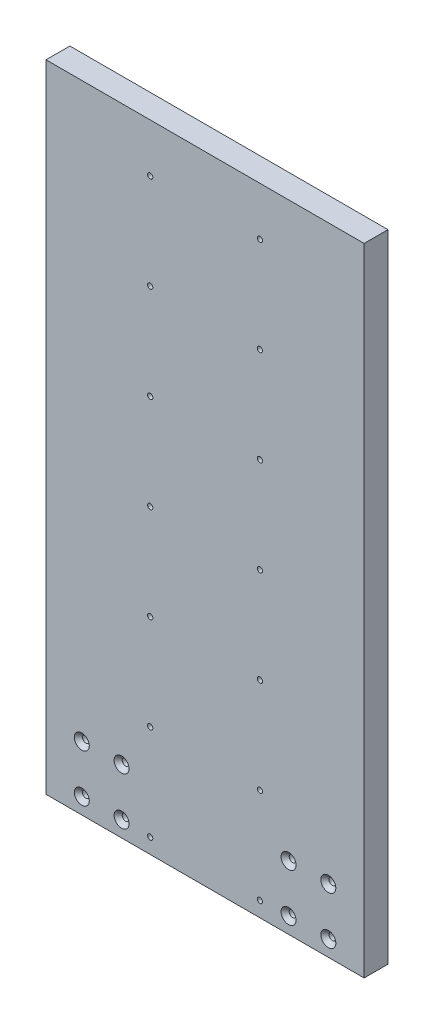
ISO-10303-21;
HEADER;
FILE_DESCRIPTION(('STEP AP214'),'2;1');
FILE_NAME('part.step','',(''),(''),'','','');
FILE_SCHEMA(('AUTOMOTIVE_DESIGN { 1 0 10303 214 1 1 1 1 }'));
ENDSEC;
DATA;
#1=APPLICATION_CONTEXT('core data for automotive mechanical design processes');
#2=APPLICATION_PROTOCOL_DEFINITION('international standard','automotive_design',2000,#1);
#3=PRODUCT_CONTEXT('',#1,'mechanical');
#4=PRODUCT('Part','Part','',(#3));
#5=PRODUCT_RELATED_PRODUCT_CATEGORY('part','',(#4));
#6=PRODUCT_DEFINITION_FORMATION('','',#4);
#7=PRODUCT_DEFINITION_CONTEXT('part definition',#1,'design');
#8=PRODUCT_DEFINITION('design','',#6,#7);
#9=PRODUCT_DEFINITION_SHAPE('','',#8);
#10=(LENGTH_UNIT() NAMED_UNIT(*) SI_UNIT(.MILLI.,.METRE.));
#11=(NAMED_UNIT(*) PLANE_ANGLE_UNIT() SI_UNIT($,.RADIAN.));
#12=(NAMED_UNIT(*) SI_UNIT($,.STERADIAN.) SOLID_ANGLE_UNIT());
#13=UNCERTAINTY_MEASURE_WITH_UNIT(LENGTH_MEASURE(1.E-05),#10,'distance_accuracy_value','');
#14=(GEOMETRIC_REPRESENTATION_CONTEXT(3) GLOBAL_UNCERTAINTY_ASSIGNED_CONTEXT((#13)) GLOBAL_UNIT_ASSIGNED_CONTEXT((#10,
#11,#12)) REPRESENTATION_CONTEXT('',''));
#15=CARTESIAN_POINT('',(0.,0.,0.));
#16=DIRECTION('',(0.,0.,1.));
#17=DIRECTION('',(1.,0.,0.));
#18=AXIS2_PLACEMENT_3D('',#15,#16,#17);
#19=CARTESIAN_POINT('',(0.,0.,15.));
#20=DIRECTION('',(0.,0.,-1.));
#21=DIRECTION('',(-1.,0.,0.));
#22=AXIS2_PLACEMENT_3D('',#19,#20,#21);
#23=PLANE('',#22);
#24=CARTESIAN_POINT('',(34.5,-190.5,15.));
#25=DIRECTION('',(0.,0.,1.));
#26=DIRECTION('',(1.,0.,0.));
#27=AXIS2_PLACEMENT_3D('',#24,#25,#26);
#28=CIRCLE('',#27,1.65);
#29=CARTESIAN_POINT('',(36.15,-190.5,15.));
#30=VERTEX_POINT('',#29);
#31=EDGE_CURVE('E367',#30,#30,#28,.T.);
#32=ORIENTED_EDGE('',*,*,#31,.F.);
#33=EDGE_LOOP('',(#32));
#34=FACE_BOUND('',#33,.T.);
#35=CARTESIAN_POINT('',(-34.5,-130.5,15.));
#36=DIRECTION('',(0.,0.,1.));
#37=DIRECTION('',(1.,0.,0.));
#38=AXIS2_PLACEMENT_3D('',#35,#36,#37);
#39=CIRCLE('',#38,1.65);
#40=CARTESIAN_POINT('',(-32.85,-130.5,15.));
#41=VERTEX_POINT('',#40);
#42=EDGE_CURVE('E362',#41,#41,#39,.T.);
#43=ORIENTED_EDGE('',*,*,#42,.F.);
#44=EDGE_LOOP('',(#43));
#45=FACE_BOUND('',#44,.T.);
#46=CARTESIAN_POINT('',(34.5,-130.5,15.));
#47=DIRECTION('',(0.,0.,1.));
#48=DIRECTION('',(1.,0.,0.));
#49=AXIS2_PLACEMENT_3D('',#46,#47,#48);
#50=CIRCLE('',#49,1.65);
#51=CARTESIAN_POINT('',(36.15,-130.5,15.));
#52=VERTEX_POINT('',#51);
#53=EDGE_CURVE('E353',#52,#52,#50,.T.);
#54=ORIENTED_EDGE('',*,*,#53,.F.);
#55=EDGE_LOOP('',(#54));
#56=FACE_BOUND('',#55,.T.);
#57=CARTESIAN_POINT('',(-34.5,-70.5,15.));
#58=DIRECTION('',(0.,0.,1.));
#59=DIRECTION('',(1.,0.,0.));
#60=AXIS2_PLACEMENT_3D('',#57,#58,#59);
#61=CIRCLE('',#60,1.65);
#62=CARTESIAN_POINT('',(-32.85,-70.5,15.));
#63=VERTEX_POINT('',#62);
#64=EDGE_CURVE('E347',#63,#63,#61,.T.);
#65=ORIENTED_EDGE('',*,*,#64,.F.);
#66=EDGE_LOOP('',(#65));
#67=FACE_BOUND('',#66,.T.);
#68=CARTESIAN_POINT('',(-34.5,-10.5,15.));
#69=DIRECTION('',(0.,0.,1.));
#70=DIRECTION('',(1.,0.,0.));
#71=AXIS2_PLACEMENT_3D('',#68,#69,#70);
#72=CIRCLE('',#71,1.65);
#73=CARTESIAN_POINT('',(-32.85,-10.5,15.));
#74=VERTEX_POINT('',#73);
#75=EDGE_CURVE('E329',#74,#74,#72,.T.);
#76=ORIENTED_EDGE('',*,*,#75,.F.);
#77=EDGE_LOOP('',(#76));
#78=FACE_BOUND('',#77,.T.);
#79=CARTESIAN_POINT('',(-34.5,49.5,15.));
#80=DIRECTION('',(0.,0.,1.));
#81=DIRECTION('',(1.,0.,0.));
#82=AXIS2_PLACEMENT_3D('',#79,#80,#81);
#83=CIRCLE('',#82,1.65);
#84=CARTESIAN_POINT('',(-32.85,49.5,15.));
#85=VERTEX_POINT('',#84);
#86=EDGE_CURVE('E314',#85,#85,#83,.T.);
#87=ORIENTED_EDGE('',*,*,#86,.F.);
#88=EDGE_LOOP('',(#87));
#89=FACE_BOUND('',#88,.T.);
#90=CARTESIAN_POINT('',(34.5,49.5,15.));
#91=DIRECTION('',(0.,0.,1.));
#92=DIRECTION('',(1.,0.,0.));
#93=AXIS2_PLACEMENT_3D('',#90,#91,#92);
#94=CIRCLE('',#93,1.65);
#95=CARTESIAN_POINT('',(36.15,49.5,15.));
#96=VERTEX_POINT('',#95);
#97=EDGE_CURVE('E308',#96,#96,#94,.T.);
#98=ORIENTED_EDGE('',*,*,#97,.F.);
#99=EDGE_LOOP('',(#98));
#100=FACE_BOUND('',#99,.T.);
#101=CARTESIAN_POINT('',(-34.5,109.5,15.));
#102=DIRECTION('',(0.,0.,1.));
#103=DIRECTION('',(1.,0.,0.));
#104=AXIS2_PLACEMENT_3D('',#101,#102,#103);
#105=CIRCLE('',#104,1.65);
#106=CARTESIAN_POINT('',(-32.85,109.5,15.));
#107=VERTEX_POINT('',#106);
#108=EDGE_CURVE('E299',#107,#107,#105,.T.);
#109=ORIENTED_EDGE('',*,*,#108,.F.);
#110=EDGE_LOOP('',(#109));
#111=FACE_BOUND('',#110,.T.);
#112=CARTESIAN_POINT('',(34.5,109.5,15.));
#113=DIRECTION('',(0.,0.,1.));
#114=DIRECTION('',(1.,0.,0.));
#115=AXIS2_PLACEMENT_3D('',#112,#113,#114);
#116=CIRCLE('',#115,1.65);
#117=CARTESIAN_POINT('',(36.15,109.5,15.));
#118=VERTEX_POINT('',#117);
#119=EDGE_CURVE('E287',#118,#118,#116,.T.);
#120=ORIENTED_EDGE('',*,*,#119,.F.);
#121=EDGE_LOOP('',(#120));
#122=FACE_BOUND('',#121,.T.);
#123=CARTESIAN_POINT('',(-34.5,169.5,15.));
#124=DIRECTION('',(0.,0.,1.));
#125=DIRECTION('',(1.,0.,0.));
#126=AXIS2_PLACEMENT_3D('',#123,#124,#125);
#127=CIRCLE('',#126,1.65);
#128=CARTESIAN_POINT('',(-32.85,169.5,15.));
#129=VERTEX_POINT('',#128);
#130=EDGE_CURVE('E282',#129,#129,#127,.T.);
#131=ORIENTED_EDGE('',*,*,#130,.F.);
#132=EDGE_LOOP('',(#131));
#133=FACE_BOUND('',#132,.T.);
#134=CARTESIAN_POINT('',(34.5,169.5,15.));
#135=DIRECTION('',(0.,0.,1.));
#136=DIRECTION('',(1.,0.,0.));
#137=AXIS2_PLACEMENT_3D('',#134,#135,#136);
#138=CIRCLE('',#137,1.65);
#139=CARTESIAN_POINT('',(36.15,169.5,15.));
#140=VERTEX_POINT('',#139);
#141=EDGE_CURVE('E273',#140,#140,#138,.T.);
#142=ORIENTED_EDGE('',*,*,#141,.F.);
#143=EDGE_LOOP('',(#142));
#144=FACE_BOUND('',#143,.T.);
#145=CARTESIAN_POINT('',(-52.5,-190.,15.));
#146=DIRECTION('',(0.,0.,1.));
#147=DIRECTION('',(1.,0.,0.));
#148=AXIS2_PLACEMENT_3D('',#145,#146,#147);
#149=CIRCLE('',#148,4.7);
#150=CARTESIAN_POINT('',(-47.8,-190.,15.));
#151=VERTEX_POINT('',#150);
#152=EDGE_CURVE('E242',#151,#151,#149,.T.);
#153=ORIENTED_EDGE('',*,*,#152,.F.);
#154=EDGE_LOOP('',(#153));
#155=FACE_BOUND('',#154,.T.);
#156=CARTESIAN_POINT('',(-77.5,-190.,15.));
#157=DIRECTION('',(0.,0.,1.));
#158=DIRECTION('',(1.,0.,0.));
#159=AXIS2_PLACEMENT_3D('',#156,#157,#158);
#160=CIRCLE('',#159,4.7);
#161=CARTESIAN_POINT('',(-72.8,-190.,15.));
#162=VERTEX_POINT('',#161);
#163=EDGE_CURVE('E230',#162,#162,#160,.T.);
#164=ORIENTED_EDGE('',*,*,#163,.F.);
#165=EDGE_LOOP('',(#164));
#166=FACE_BOUND('',#165,.T.);
#167=CARTESIAN_POINT('',(52.4999999999997,-160.,15.));
#168=DIRECTION('',(0.,0.,1.));
#169=DIRECTION('',(1.,0.,0.));
#170=AXIS2_PLACEMENT_3D('',#167,#168,#169);
#171=CIRCLE('',#170,4.7);
#172=CARTESIAN_POINT('',(57.1999999999997,-160.,15.));
#173=VERTEX_POINT('',#172);
#174=EDGE_CURVE('E217',#173,#173,#171,.T.);
#175=ORIENTED_EDGE('',*,*,#174,.F.);
#176=EDGE_LOOP('',(#175));
#177=FACE_BOUND('',#176,.T.);
#178=CARTESIAN_POINT('',(77.4999999999997,-160.,15.));
#179=DIRECTION('',(0.,0.,1.));
#180=DIRECTION('',(1.,0.,0.));
#181=AXIS2_PLACEMENT_3D('',#178,#179,#180);
#182=CIRCLE('',#181,4.7);
#183=CARTESIAN_POINT('',(82.1999999999997,-160.,15.));
#184=VERTEX_POINT('',#183);
#185=EDGE_CURVE('E206',#184,#184,#182,.T.);
#186=ORIENTED_EDGE('',*,*,#185,.F.);
#187=EDGE_LOOP('',(#186));
#188=FACE_BOUND('',#187,.T.);
#189=CARTESIAN_POINT('',(77.5,-190.,15.));
#190=DIRECTION('',(0.,0.,1.));
#191=DIRECTION('',(1.,0.,0.));
#192=AXIS2_PLACEMENT_3D('',#189,#190,#191);
#193=CIRCLE('',#192,4.7);
#194=CARTESIAN_POINT('',(82.2,-190.,15.));
#195=VERTEX_POINT('',#194);
#196=EDGE_CURVE('E194',#195,#195,#193,.T.);
#197=ORIENTED_EDGE('',*,*,#196,.F.);
#198=EDGE_LOOP('',(#197));
#199=FACE_BOUND('',#198,.T.);
#200=CARTESIAN_POINT('',(52.5,-190.,15.));
#201=DIRECTION('',(0.,0.,1.));
#202=DIRECTION('',(1.,0.,0.));
#203=AXIS2_PLACEMENT_3D('',#200,#201,#202);
#204=CIRCLE('',#203,4.7);
#205=CARTESIAN_POINT('',(57.2,-190.,15.));
#206=VERTEX_POINT('',#205);
#207=EDGE_CURVE('E179',#206,#206,#204,.T.);
#208=ORIENTED_EDGE('',*,*,#207,.F.);
#209=EDGE_LOOP('',(#208));
#210=FACE_BOUND('',#209,.T.);
#211=DIRECTION('',(0.,-1.,0.));
#212=VECTOR('',#211,1.);
#213=CARTESIAN_POINT('',(100.,200.,15.));
#214=LINE('',#213,#212);
#215=CARTESIAN_POINT('',(100.,200.,15.));
#216=VERTEX_POINT('',#215);
#217=CARTESIAN_POINT('',(100.,-200.,15.));
#218=VERTEX_POINT('',#217);
#219=EDGE_CURVE('E111',#216,#218,#214,.T.);
#220=ORIENTED_EDGE('',*,*,#219,.F.);
#221=DIRECTION('',(-1.,0.,0.));
#222=VECTOR('',#221,1.);
#223=CARTESIAN_POINT('',(100.,200.,15.));
#224=LINE('',#223,#222);
#225=CARTESIAN_POINT('',(-100.,200.,15.));
#226=VERTEX_POINT('',#225);
#227=EDGE_CURVE('E101',#216,#226,#224,.T.);
#228=ORIENTED_EDGE('',*,*,#227,.T.);
#229=DIRECTION('',(0.,-1.,0.));
#230=VECTOR('',#229,1.);
#231=CARTESIAN_POINT('',(-100.,200.,15.));
#232=LINE('',#231,#230);
#233=CARTESIAN_POINT('',(-99.9999999999999,-200.,15.));
#234=VERTEX_POINT('',#233);
#235=EDGE_CURVE('E96',#226,#234,#232,.T.);
#236=ORIENTED_EDGE('',*,*,#235,.T.);
#237=DIRECTION('',(-1.,0.,0.));
#238=VECTOR('',#237,1.);
#239=CARTESIAN_POINT('',(100.,-200.,15.));
#240=LINE('',#239,#238);
#241=EDGE_CURVE('E99',#218,#234,#240,.T.);
#242=ORIENTED_EDGE('',*,*,#241,.F.);
#243=EDGE_LOOP('',(#220,#228,#236,#242));
#244=FACE_BOUND('',#243,.T.);
#245=CARTESIAN_POINT('',(-52.5000000000003,-160.,15.));
#246=DIRECTION('',(0.,0.,1.));
#247=DIRECTION('',(1.,0.,0.));
#248=AXIS2_PLACEMENT_3D('',#245,#246,#247);
#249=CIRCLE('',#248,4.7);
#250=CARTESIAN_POINT('',(-47.8000000000003,-160.,15.));
#251=VERTEX_POINT('',#250);
#252=EDGE_CURVE('E255',#251,#251,#249,.T.);
#253=ORIENTED_EDGE('',*,*,#252,.F.);
#254=EDGE_LOOP('',(#253));
#255=FACE_BOUND('',#254,.T.);
#256=CARTESIAN_POINT('',(-77.5000000000003,-160.,15.));
#257=DIRECTION('',(0.,0.,1.));
#258=DIRECTION('',(1.,0.,0.));
#259=AXIS2_PLACEMENT_3D('',#256,#257,#258);
#260=CIRCLE('',#259,4.7);
#261=CARTESIAN_POINT('',(-72.8000000000003,-160.,15.));
#262=VERTEX_POINT('',#261);
#263=EDGE_CURVE('E266',#262,#262,#260,.T.);
#264=ORIENTED_EDGE('',*,*,#263,.F.);
#265=EDGE_LOOP('',(#264));
#266=FACE_BOUND('',#265,.T.);
#267=CARTESIAN_POINT('',(34.5,-10.5,15.));
#268=DIRECTION('',(0.,0.,1.));
#269=DIRECTION('',(1.,0.,0.));
#270=AXIS2_PLACEMENT_3D('',#267,#268,#269);
#271=CIRCLE('',#270,1.65);
#272=CARTESIAN_POINT('',(36.15,-10.5,15.));
#273=VERTEX_POINT('',#272);
#274=EDGE_CURVE('E325',#273,#273,#271,.T.);
#275=ORIENTED_EDGE('',*,*,#274,.F.);
#276=EDGE_LOOP('',(#275));
#277=FACE_BOUND('',#276,.T.);
#278=CARTESIAN_POINT('',(34.5,-70.5,15.));
#279=DIRECTION('',(0.,0.,1.));
#280=DIRECTION('',(1.,0.,0.));
#281=AXIS2_PLACEMENT_3D('',#278,#279,#280);
#282=CIRCLE('',#281,1.65);
#283=CARTESIAN_POINT('',(36.15,-70.5,15.));
#284=VERTEX_POINT('',#283);
#285=EDGE_CURVE('E339',#284,#284,#282,.T.);
#286=ORIENTED_EDGE('',*,*,#285,.F.);
#287=EDGE_LOOP('',(#286));
#288=FACE_BOUND('',#287,.T.);
#289=CARTESIAN_POINT('',(-34.5,-190.5,15.));
#290=DIRECTION('',(0.,0.,1.));
#291=DIRECTION('',(1.,0.,0.));
#292=AXIS2_PLACEMENT_3D('',#289,#290,#291);
#293=CIRCLE('',#292,1.65);
#294=CARTESIAN_POINT('',(-32.85,-190.5,15.));
#295=VERTEX_POINT('',#294);
#296=EDGE_CURVE('E378',#295,#295,#293,.T.);
#297=ORIENTED_EDGE('',*,*,#296,.F.);
#298=EDGE_LOOP('',(#297));
#299=FACE_BOUND('',#298,.T.);
#300=ADVANCED_FACE('F47',(#34,#45,#56,#67,#78,#89,#100,#111,#122,#133,#144,#155,#166,#177,#188,
#199,#210,#244,#255,#266,#277,#288,#299),#23,.F.);
#301=CARTESIAN_POINT('',(0.,0.,0.));
#302=DIRECTION('',(0.,0.,-1.));
#303=DIRECTION('',(-1.,0.,0.));
#304=AXIS2_PLACEMENT_3D('',#301,#302,#303);
#305=PLANE('',#304);
#306=CARTESIAN_POINT('',(-34.5,-190.5,0.));
#307=DIRECTION('',(0.,0.,1.));
#308=DIRECTION('',(1.,0.,0.));
#309=AXIS2_PLACEMENT_3D('',#306,#307,#308);
#310=CIRCLE('',#309,1.65);
#311=CARTESIAN_POINT('',(-32.85,-190.5,0.));
#312=VERTEX_POINT('',#311);
#313=EDGE_CURVE('E372',#312,#312,#310,.T.);
#314=ORIENTED_EDGE('',*,*,#313,.T.);
#315=EDGE_LOOP('',(#314));
#316=FACE_BOUND('',#315,.T.);
#317=CARTESIAN_POINT('',(34.5,-190.5,0.));
#318=DIRECTION('',(0.,0.,1.));
#319=DIRECTION('',(1.,0.,0.));
#320=AXIS2_PLACEMENT_3D('',#317,#318,#319);
#321=CIRCLE('',#320,1.65);
#322=CARTESIAN_POINT('',(36.15,-190.5,0.));
#323=VERTEX_POINT('',#322);
#324=EDGE_CURVE('E368',#323,#323,#321,.T.);
#325=ORIENTED_EDGE('',*,*,#324,.T.);
#326=EDGE_LOOP('',(#325));
#327=FACE_BOUND('',#326,.T.);
#328=CARTESIAN_POINT('',(-34.5,-130.5,0.));
#329=DIRECTION('',(0.,0.,1.));
#330=DIRECTION('',(1.,0.,0.));
#331=AXIS2_PLACEMENT_3D('',#328,#329,#330);
#332=CIRCLE('',#331,1.65);
#333=CARTESIAN_POINT('',(-32.85,-130.5,0.));
#334=VERTEX_POINT('',#333);
#335=EDGE_CURVE('E356',#334,#334,#332,.T.);
#336=ORIENTED_EDGE('',*,*,#335,.T.);
#337=EDGE_LOOP('',(#336));
#338=FACE_BOUND('',#337,.T.);
#339=CARTESIAN_POINT('',(34.5,-130.5,0.));
#340=DIRECTION('',(0.,0.,1.));
#341=DIRECTION('',(1.,0.,0.));
#342=AXIS2_PLACEMENT_3D('',#339,#340,#341);
#343=CIRCLE('',#342,1.65);
#344=CARTESIAN_POINT('',(36.15,-130.5,0.));
#345=VERTEX_POINT('',#344);
#346=EDGE_CURVE('E348',#345,#345,#343,.T.);
#347=ORIENTED_EDGE('',*,*,#346,.T.);
#348=EDGE_LOOP('',(#347));
#349=FACE_BOUND('',#348,.T.);
#350=CARTESIAN_POINT('',(-34.5,-10.5,0.));
#351=DIRECTION('',(0.,0.,1.));
#352=DIRECTION('',(1.,0.,0.));
#353=AXIS2_PLACEMENT_3D('',#350,#351,#352);
#354=CIRCLE('',#353,1.65);
#355=CARTESIAN_POINT('',(-32.85,-10.5,0.));
#356=VERTEX_POINT('',#355);
#357=EDGE_CURVE('E326',#356,#356,#354,.T.);
#358=ORIENTED_EDGE('',*,*,#357,.T.);
#359=EDGE_LOOP('',(#358));
#360=FACE_BOUND('',#359,.T.);
#361=CARTESIAN_POINT('',(-77.5000000000003,-160.,0.));
#362=DIRECTION('',(0.,0.,1.));
#363=DIRECTION('',(1.,0.,0.));
#364=AXIS2_PLACEMENT_3D('',#361,#362,#363);
#365=CIRCLE('',#364,2.14999999999999);
#366=CARTESIAN_POINT('',(-75.3500000000003,-160.,0.));
#367=VERTEX_POINT('',#366);
#368=EDGE_CURVE('E256',#367,#367,#365,.T.);
#369=ORIENTED_EDGE('',*,*,#368,.T.);
#370=EDGE_LOOP('',(#369));
#371=FACE_BOUND('',#370,.T.);
#372=CARTESIAN_POINT('',(77.5,-190.,0.));
#373=DIRECTION('',(0.,0.,1.));
#374=DIRECTION('',(1.,0.,0.));
#375=AXIS2_PLACEMENT_3D('',#372,#373,#374);
#376=CIRCLE('',#375,2.14999999999999);
#377=CARTESIAN_POINT('',(79.65,-190.,0.));
#378=VERTEX_POINT('',#377);
#379=EDGE_CURVE('E184',#378,#378,#376,.T.);
#380=ORIENTED_EDGE('',*,*,#379,.T.);
#381=EDGE_LOOP('',(#380));
#382=FACE_BOUND('',#381,.T.);
#383=CARTESIAN_POINT('',(52.5,-190.,0.));
#384=DIRECTION('',(0.,0.,1.));
#385=DIRECTION('',(1.,0.,0.));
#386=AXIS2_PLACEMENT_3D('',#383,#384,#385);
#387=CIRCLE('',#386,2.14999999999999);
#388=CARTESIAN_POINT('',(54.65,-190.,0.));
#389=VERTEX_POINT('',#388);
#390=EDGE_CURVE('E130',#389,#389,#387,.T.);
#391=ORIENTED_EDGE('',*,*,#390,.T.);
#392=EDGE_LOOP('',(#391));
#393=FACE_BOUND('',#392,.T.);
#394=DIRECTION('',(0.,-1.,0.));
#395=VECTOR('',#394,1.);
#396=CARTESIAN_POINT('',(100.,200.,0.));
#397=LINE('',#396,#395);
#398=CARTESIAN_POINT('',(100.,200.,0.));
#399=VERTEX_POINT('',#398);
#400=CARTESIAN_POINT('',(100.,-200.,0.));
#401=VERTEX_POINT('',#400);
#402=EDGE_CURVE('E125',#399,#401,#397,.T.);
#403=ORIENTED_EDGE('',*,*,#402,.T.);
#404=DIRECTION('',(-1.,0.,0.));
#405=VECTOR('',#404,1.);
#406=CARTESIAN_POINT('',(100.,-200.,0.));
#407=LINE('',#406,#405);
#408=CARTESIAN_POINT('',(-99.9999999999999,-200.,0.));
#409=VERTEX_POINT('',#408);
#410=EDGE_CURVE('E127',#401,#409,#407,.T.);
#411=ORIENTED_EDGE('',*,*,#410,.T.);
#412=DIRECTION('',(0.,-1.,0.));
#413=VECTOR('',#412,1.);
#414=CARTESIAN_POINT('',(-100.,200.,0.));
#415=LINE('',#414,#413);
#416=CARTESIAN_POINT('',(-100.,200.,0.));
#417=VERTEX_POINT('',#416);
#418=EDGE_CURVE('E108',#417,#409,#415,.T.);
#419=ORIENTED_EDGE('',*,*,#418,.F.);
#420=DIRECTION('',(-1.,0.,0.));
#421=VECTOR('',#420,1.);
#422=CARTESIAN_POINT('',(100.,200.,0.));
#423=LINE('',#422,#421);
#424=EDGE_CURVE('E84',#399,#417,#423,.T.);
#425=ORIENTED_EDGE('',*,*,#424,.F.);
#426=EDGE_LOOP('',(#403,#411,#419,#425));
#427=FACE_BOUND('',#426,.T.);
#428=CARTESIAN_POINT('',(77.4999999999997,-160.,0.));
#429=DIRECTION('',(0.,0.,1.));
#430=DIRECTION('',(1.,0.,0.));
#431=AXIS2_PLACEMENT_3D('',#428,#429,#430);
#432=CIRCLE('',#431,2.14999999999999);
#433=CARTESIAN_POINT('',(79.6499999999997,-160.,0.));
#434=VERTEX_POINT('',#433);
#435=EDGE_CURVE('E196',#434,#434,#432,.T.);
#436=ORIENTED_EDGE('',*,*,#435,.T.);
#437=EDGE_LOOP('',(#436));
#438=FACE_BOUND('',#437,.T.);
#439=CARTESIAN_POINT('',(52.4999999999997,-160.,0.));
#440=DIRECTION('',(0.,0.,1.));
#441=DIRECTION('',(1.,0.,0.));
#442=AXIS2_PLACEMENT_3D('',#439,#440,#441);
#443=CIRCLE('',#442,2.14999999999999);
#444=CARTESIAN_POINT('',(54.6499999999997,-160.,0.));
#445=VERTEX_POINT('',#444);
#446=EDGE_CURVE('E209',#445,#445,#443,.T.);
#447=ORIENTED_EDGE('',*,*,#446,.T.);
#448=EDGE_LOOP('',(#447));
#449=FACE_BOUND('',#448,.T.);
#450=CARTESIAN_POINT('',(-77.5,-190.,0.));
#451=DIRECTION('',(0.,0.,1.));
#452=DIRECTION('',(1.,0.,0.));
#453=AXIS2_PLACEMENT_3D('',#450,#451,#452);
#454=CIRCLE('',#453,2.14999999999999);
#455=CARTESIAN_POINT('',(-75.35,-190.,0.));
#456=VERTEX_POINT('',#455);
#457=EDGE_CURVE('E225',#456,#456,#454,.T.);
#458=ORIENTED_EDGE('',*,*,#457,.T.);
#459=EDGE_LOOP('',(#458));
#460=FACE_BOUND('',#459,.T.);
#461=CARTESIAN_POINT('',(-52.5,-190.,0.));
#462=DIRECTION('',(0.,0.,1.));
#463=DIRECTION('',(1.,0.,0.));
#464=AXIS2_PLACEMENT_3D('',#461,#462,#463);
#465=CIRCLE('',#464,2.14999999999999);
#466=CARTESIAN_POINT('',(-50.35,-190.,0.));
#467=VERTEX_POINT('',#466);
#468=EDGE_CURVE('E234',#467,#467,#465,.T.);
#469=ORIENTED_EDGE('',*,*,#468,.T.);
#470=EDGE_LOOP('',(#469));
#471=FACE_BOUND('',#470,.T.);
#472=CARTESIAN_POINT('',(-52.5000000000003,-160.,0.));
#473=DIRECTION('',(0.,0.,1.));
#474=DIRECTION('',(1.,0.,0.));
#475=AXIS2_PLACEMENT_3D('',#472,#473,#474);
#476=CIRCLE('',#475,2.14999999999999);
#477=CARTESIAN_POINT('',(-50.3500000000003,-160.,0.));
#478=VERTEX_POINT('',#477);
#479=EDGE_CURVE('E248',#478,#478,#476,.T.);
#480=ORIENTED_EDGE('',*,*,#479,.T.);
#481=EDGE_LOOP('',(#480));
#482=FACE_BOUND('',#481,.T.);
#483=CARTESIAN_POINT('',(34.5,169.5,0.));
#484=DIRECTION('',(0.,0.,1.));
#485=DIRECTION('',(1.,0.,0.));
#486=AXIS2_PLACEMENT_3D('',#483,#484,#485);
#487=CIRCLE('',#486,1.65);
#488=CARTESIAN_POINT('',(36.15,169.5,0.));
#489=VERTEX_POINT('',#488);
#490=EDGE_CURVE('E269',#489,#489,#487,.T.);
#491=ORIENTED_EDGE('',*,*,#490,.T.);
#492=EDGE_LOOP('',(#491));
#493=FACE_BOUND('',#492,.T.);
#494=CARTESIAN_POINT('',(-34.5,169.5,0.));
#495=DIRECTION('',(0.,0.,1.));
#496=DIRECTION('',(1.,0.,0.));
#497=AXIS2_PLACEMENT_3D('',#494,#495,#496);
#498=CIRCLE('',#497,1.65);
#499=CARTESIAN_POINT('',(-32.85,169.5,0.));
#500=VERTEX_POINT('',#499);
#501=EDGE_CURVE('E279',#500,#500,#498,.T.);
#502=ORIENTED_EDGE('',*,*,#501,.T.);
#503=EDGE_LOOP('',(#502));
#504=FACE_BOUND('',#503,.T.);
#505=CARTESIAN_POINT('',(34.5,109.5,0.));
#506=DIRECTION('',(0.,0.,1.));
#507=DIRECTION('',(1.,0.,0.));
#508=AXIS2_PLACEMENT_3D('',#505,#506,#507);
#509=CIRCLE('',#508,1.65);
#510=CARTESIAN_POINT('',(36.15,109.5,0.));
#511=VERTEX_POINT('',#510);
#512=EDGE_CURVE('E288',#511,#511,#509,.T.);
#513=ORIENTED_EDGE('',*,*,#512,.T.);
#514=EDGE_LOOP('',(#513));
#515=FACE_BOUND('',#514,.T.);
#516=CARTESIAN_POINT('',(-34.5,109.5,0.));
#517=DIRECTION('',(0.,0.,1.));
#518=DIRECTION('',(1.,0.,0.));
#519=AXIS2_PLACEMENT_3D('',#516,#517,#518);
#520=CIRCLE('',#519,1.65);
#521=CARTESIAN_POINT('',(-32.85,109.5,0.));
#522=VERTEX_POINT('',#521);
#523=EDGE_CURVE('E294',#522,#522,#520,.T.);
#524=ORIENTED_EDGE('',*,*,#523,.T.);
#525=EDGE_LOOP('',(#524));
#526=FACE_BOUND('',#525,.T.);
#527=CARTESIAN_POINT('',(34.5,49.5,0.));
#528=DIRECTION('',(0.,0.,1.));
#529=DIRECTION('',(1.,0.,0.));
#530=AXIS2_PLACEMENT_3D('',#527,#528,#529);
#531=CIRCLE('',#530,1.65);
#532=CARTESIAN_POINT('',(36.15,49.5,0.));
#533=VERTEX_POINT('',#532);
#534=EDGE_CURVE('E305',#533,#533,#531,.T.);
#535=ORIENTED_EDGE('',*,*,#534,.T.);
#536=EDGE_LOOP('',(#535));
#537=FACE_BOUND('',#536,.T.);
#538=CARTESIAN_POINT('',(-34.5,49.5,0.));
#539=DIRECTION('',(0.,0.,1.));
#540=DIRECTION('',(1.,0.,0.));
#541=AXIS2_PLACEMENT_3D('',#538,#539,#540);
#542=CIRCLE('',#541,1.65);
#543=CARTESIAN_POINT('',(-32.85,49.5,0.));
#544=VERTEX_POINT('',#543);
#545=EDGE_CURVE('E309',#544,#544,#542,.T.);
#546=ORIENTED_EDGE('',*,*,#545,.T.);
#547=EDGE_LOOP('',(#546));
#548=FACE_BOUND('',#547,.T.);
#549=CARTESIAN_POINT('',(34.5,-10.5,0.));
#550=DIRECTION('',(0.,0.,1.));
#551=DIRECTION('',(1.,0.,0.));
#552=AXIS2_PLACEMENT_3D('',#549,#550,#551);
#553=CIRCLE('',#552,1.65);
#554=CARTESIAN_POINT('',(36.15,-10.5,0.));
#555=VERTEX_POINT('',#554);
#556=EDGE_CURVE('E318',#555,#555,#553,.T.);
#557=ORIENTED_EDGE('',*,*,#556,.T.);
#558=EDGE_LOOP('',(#557));
#559=FACE_BOUND('',#558,.T.);
#560=CARTESIAN_POINT('',(34.5,-70.5,0.));
#561=DIRECTION('',(0.,0.,1.));
#562=DIRECTION('',(1.,0.,0.));
#563=AXIS2_PLACEMENT_3D('',#560,#561,#562);
#564=CIRCLE('',#563,1.65);
#565=CARTESIAN_POINT('',(36.15,-70.5,0.));
#566=VERTEX_POINT('',#565);
#567=EDGE_CURVE('E331',#566,#566,#564,.T.);
#568=ORIENTED_EDGE('',*,*,#567,.T.);
#569=EDGE_LOOP('',(#568));
#570=FACE_BOUND('',#569,.T.);
#571=CARTESIAN_POINT('',(-34.5,-70.5,0.));
#572=DIRECTION('',(0.,0.,1.));
#573=DIRECTION('',(1.,0.,0.));
#574=AXIS2_PLACEMENT_3D('',#571,#572,#573);
#575=CIRCLE('',#574,1.65);
#576=CARTESIAN_POINT('',(-32.85,-70.5,0.));
#577=VERTEX_POINT('',#576);
#578=EDGE_CURVE('E345',#577,#577,#575,.T.);
#579=ORIENTED_EDGE('',*,*,#578,.T.);
#580=EDGE_LOOP('',(#579));
#581=FACE_BOUND('',#580,.T.);
#582=ADVANCED_FACE('F138',(#316,#327,#338,#349,#360,#371,#382,#393,#427,#438,#449,#460,#471,
#482,#493,#504,#515,#526,#537,#548,#559,#570,#581),#305,.T.);
#583=CARTESIAN_POINT('',(100.,200.,15.));
#584=DIRECTION('',(1.,0.,0.));
#585=DIRECTION('',(0.,1.,0.));
#586=AXIS2_PLACEMENT_3D('',#583,#584,#585);
#587=PLANE('',#586);
#588=ORIENTED_EDGE('',*,*,#402,.F.);
#589=DIRECTION('',(0.,0.,-1.));
#590=VECTOR('',#589,1.);
#591=CARTESIAN_POINT('',(100.,200.,15.));
#592=LINE('',#591,#590);
#593=EDGE_CURVE('E11',#216,#399,#592,.T.);
#594=ORIENTED_EDGE('',*,*,#593,.F.);
#595=ORIENTED_EDGE('',*,*,#219,.T.);
#596=DIRECTION('',(0.,0.,-1.));
#597=VECTOR('',#596,1.);
#598=CARTESIAN_POINT('',(100.,-200.,15.));
#599=LINE('',#598,#597);
#600=EDGE_CURVE('E52',#218,#401,#599,.T.);
#601=ORIENTED_EDGE('',*,*,#600,.T.);
#602=EDGE_LOOP('',(#588,#594,#595,#601));
#603=FACE_BOUND('',#602,.T.);
#604=ADVANCED_FACE('F51',(#603),#587,.T.);
#605=CARTESIAN_POINT('',(100.,200.,15.));
#606=DIRECTION('',(0.,-1.,0.));
#607=DIRECTION('',(1.,0.,0.));
#608=AXIS2_PLACEMENT_3D('',#605,#606,#607);
#609=PLANE('',#608);
#610=ORIENTED_EDGE('',*,*,#424,.T.);
#611=DIRECTION('',(0.,0.,-1.));
#612=VECTOR('',#611,1.);
#613=CARTESIAN_POINT('',(-100.,200.,15.));
#614=LINE('',#613,#612);
#615=EDGE_CURVE('E58',#226,#417,#614,.T.);
#616=ORIENTED_EDGE('',*,*,#615,.F.);
#617=ORIENTED_EDGE('',*,*,#227,.F.);
#618=ORIENTED_EDGE('',*,*,#593,.T.);
#619=EDGE_LOOP('',(#610,#616,#617,#618));
#620=FACE_BOUND('',#619,.T.);
#621=ADVANCED_FACE('F137',(#620),#609,.F.);
#622=CARTESIAN_POINT('',(-100.,200.,15.));
#623=DIRECTION('',(1.,0.,0.));
#624=DIRECTION('',(0.,1.,0.));
#625=AXIS2_PLACEMENT_3D('',#622,#623,#624);
#626=PLANE('',#625);
#627=ORIENTED_EDGE('',*,*,#418,.T.);
#628=DIRECTION('',(0.,0.,-1.));
#629=VECTOR('',#628,1.);
#630=CARTESIAN_POINT('',(-99.9999999999999,-200.,15.));
#631=LINE('',#630,#629);
#632=EDGE_CURVE('E106',#234,#409,#631,.T.);
#633=ORIENTED_EDGE('',*,*,#632,.F.);
#634=ORIENTED_EDGE('',*,*,#235,.F.);
#635=ORIENTED_EDGE('',*,*,#615,.T.);
#636=EDGE_LOOP('',(#627,#633,#634,#635));
#637=FACE_BOUND('',#636,.T.);
#638=ADVANCED_FACE('F110',(#637),#626,.F.);
#639=CARTESIAN_POINT('',(100.,-200.,15.));
#640=DIRECTION('',(0.,-1.,0.));
#641=DIRECTION('',(1.,0.,0.));
#642=AXIS2_PLACEMENT_3D('',#639,#640,#641);
#643=PLANE('',#642);
#644=ORIENTED_EDGE('',*,*,#410,.F.);
#645=ORIENTED_EDGE('',*,*,#600,.F.);
#646=ORIENTED_EDGE('',*,*,#241,.T.);
#647=ORIENTED_EDGE('',*,*,#632,.T.);
#648=EDGE_LOOP('',(#644,#645,#646,#647));
#649=FACE_BOUND('',#648,.T.);
#650=ADVANCED_FACE('F115',(#649),#643,.T.);
#651=CARTESIAN_POINT('',(52.5,-190.,15.));
#652=DIRECTION('',(0.,0.,1.));
#653=DIRECTION('',(1.,0.,0.));
#654=AXIS2_PLACEMENT_3D('',#651,#652,#653);
#655=CYLINDRICAL_SURFACE('',#654,2.14999999999999);
#656=ORIENTED_EDGE('',*,*,#390,.F.);
#657=EDGE_LOOP('',(#656));
#658=FACE_BOUND('',#657,.T.);
#659=CARTESIAN_POINT('',(52.5,-190.,12.45));
#660=DIRECTION('',(0.,0.,1.));
#661=DIRECTION('',(1.,0.,0.));
#662=AXIS2_PLACEMENT_3D('',#659,#660,#661);
#663=CIRCLE('',#662,2.14999999999999);
#664=CARTESIAN_POINT('',(54.65,-190.,12.45));
#665=VERTEX_POINT('',#664);
#666=EDGE_CURVE('E180',#665,#665,#663,.T.);
#667=ORIENTED_EDGE('',*,*,#666,.T.);
#668=EDGE_LOOP('',(#667));
#669=FACE_BOUND('',#668,.T.);
#670=ADVANCED_FACE('F160',(#658,#669),#655,.F.);
#671=CARTESIAN_POINT('',(52.5,-190.,15.));
#672=DIRECTION('',(0.,0.,1.));
#673=DIRECTION('',(1.,0.,0.));
#674=AXIS2_PLACEMENT_3D('',#671,#672,#673);
#675=CONICAL_SURFACE('',#674,4.7,0.785398163397448);
#676=ORIENTED_EDGE('',*,*,#666,.F.);
#677=EDGE_LOOP('',(#676));
#678=FACE_BOUND('',#677,.T.);
#679=ORIENTED_EDGE('',*,*,#207,.T.);
#680=EDGE_LOOP('',(#679));
#681=FACE_BOUND('',#680,.T.);
#682=ADVANCED_FACE('F164',(#678,#681),#675,.F.);
#683=CARTESIAN_POINT('',(77.5,-190.,15.));
#684=DIRECTION('',(0.,0.,1.));
#685=DIRECTION('',(1.,0.,0.));
#686=AXIS2_PLACEMENT_3D('',#683,#684,#685);
#687=CYLINDRICAL_SURFACE('',#686,2.14999999999999);
#688=ORIENTED_EDGE('',*,*,#379,.F.);
#689=EDGE_LOOP('',(#688));
#690=FACE_BOUND('',#689,.T.);
#691=CARTESIAN_POINT('',(77.5,-190.,12.45));
#692=DIRECTION('',(0.,0.,1.));
#693=DIRECTION('',(1.,0.,0.));
#694=AXIS2_PLACEMENT_3D('',#691,#692,#693);
#695=CIRCLE('',#694,2.14999999999999);
#696=CARTESIAN_POINT('',(79.65,-190.,12.45));
#697=VERTEX_POINT('',#696);
#698=EDGE_CURVE('E190',#697,#697,#695,.T.);
#699=ORIENTED_EDGE('',*,*,#698,.T.);
#700=EDGE_LOOP('',(#699));
#701=FACE_BOUND('',#700,.T.);
#702=ADVANCED_FACE('F168',(#690,#701),#687,.F.);
#703=CARTESIAN_POINT('',(77.5,-190.,15.));
#704=DIRECTION('',(0.,0.,1.));
#705=DIRECTION('',(1.,0.,0.));
#706=AXIS2_PLACEMENT_3D('',#703,#704,#705);
#707=CONICAL_SURFACE('',#706,4.7,0.785398163397448);
#708=ORIENTED_EDGE('',*,*,#698,.F.);
#709=EDGE_LOOP('',(#708));
#710=FACE_BOUND('',#709,.T.);
#711=ORIENTED_EDGE('',*,*,#196,.T.);
#712=EDGE_LOOP('',(#711));
#713=FACE_BOUND('',#712,.T.);
#714=ADVANCED_FACE('F489',(#710,#713),#707,.F.);
#715=CARTESIAN_POINT('',(77.4999999999997,-160.,15.));
#716=DIRECTION('',(0.,0.,1.));
#717=DIRECTION('',(1.,0.,0.));
#718=AXIS2_PLACEMENT_3D('',#715,#716,#717);
#719=CYLINDRICAL_SURFACE('',#718,2.14999999999999);
#720=ORIENTED_EDGE('',*,*,#435,.F.);
#721=EDGE_LOOP('',(#720));
#722=FACE_BOUND('',#721,.T.);
#723=CARTESIAN_POINT('',(77.4999999999997,-160.,12.45));
#724=DIRECTION('',(0.,0.,1.));
#725=DIRECTION('',(1.,0.,0.));
#726=AXIS2_PLACEMENT_3D('',#723,#724,#725);
#727=CIRCLE('',#726,2.14999999999999);
#728=CARTESIAN_POINT('',(79.6499999999997,-160.,12.45));
#729=VERTEX_POINT('',#728);
#730=EDGE_CURVE('E205',#729,#729,#727,.T.);
#731=ORIENTED_EDGE('',*,*,#730,.T.);
#732=EDGE_LOOP('',(#731));
#733=FACE_BOUND('',#732,.T.);
#734=ADVANCED_FACE('F486',(#722,#733),#719,.F.);
#735=CARTESIAN_POINT('',(77.4999999999997,-160.,15.));
#736=DIRECTION('',(0.,0.,1.));
#737=DIRECTION('',(1.,0.,0.));
#738=AXIS2_PLACEMENT_3D('',#735,#736,#737);
#739=CONICAL_SURFACE('',#738,4.7,0.785398163397448);
#740=ORIENTED_EDGE('',*,*,#730,.F.);
#741=EDGE_LOOP('',(#740));
#742=FACE_BOUND('',#741,.T.);
#743=ORIENTED_EDGE('',*,*,#185,.T.);
#744=EDGE_LOOP('',(#743));
#745=FACE_BOUND('',#744,.T.);
#746=ADVANCED_FACE('F485',(#742,#745),#739,.F.);
#747=CARTESIAN_POINT('',(52.4999999999997,-160.,15.));
#748=DIRECTION('',(0.,0.,1.));
#749=DIRECTION('',(1.,0.,0.));
#750=AXIS2_PLACEMENT_3D('',#747,#748,#749);
#751=CYLINDRICAL_SURFACE('',#750,2.14999999999999);
#752=ORIENTED_EDGE('',*,*,#446,.F.);
#753=EDGE_LOOP('',(#752));
#754=FACE_BOUND('',#753,.T.);
#755=CARTESIAN_POINT('',(52.4999999999997,-160.,12.45));
#756=DIRECTION('',(0.,0.,1.));
#757=DIRECTION('',(1.,0.,0.));
#758=AXIS2_PLACEMENT_3D('',#755,#756,#757);
#759=CIRCLE('',#758,2.14999999999999);
#760=CARTESIAN_POINT('',(54.6499999999997,-160.,12.45));
#761=VERTEX_POINT('',#760);
#762=EDGE_CURVE('E212',#761,#761,#759,.T.);
#763=ORIENTED_EDGE('',*,*,#762,.T.);
#764=EDGE_LOOP('',(#763));
#765=FACE_BOUND('',#764,.T.);
#766=ADVANCED_FACE('F476',(#754,#765),#751,.F.);
#767=CARTESIAN_POINT('',(52.4999999999997,-160.,15.));
#768=DIRECTION('',(0.,0.,1.));
#769=DIRECTION('',(1.,0.,0.));
#770=AXIS2_PLACEMENT_3D('',#767,#768,#769);
#771=CONICAL_SURFACE('',#770,4.7,0.785398163397448);
#772=ORIENTED_EDGE('',*,*,#762,.F.);
#773=EDGE_LOOP('',(#772));
#774=FACE_BOUND('',#773,.T.);
#775=ORIENTED_EDGE('',*,*,#174,.T.);
#776=EDGE_LOOP('',(#775));
#777=FACE_BOUND('',#776,.T.);
#778=ADVANCED_FACE('F475',(#774,#777),#771,.F.);
#779=CARTESIAN_POINT('',(-77.5,-190.,15.));
#780=DIRECTION('',(0.,0.,1.));
#781=DIRECTION('',(1.,0.,0.));
#782=AXIS2_PLACEMENT_3D('',#779,#780,#781);
#783=CYLINDRICAL_SURFACE('',#782,2.14999999999999);
#784=ORIENTED_EDGE('',*,*,#457,.F.);
#785=EDGE_LOOP('',(#784));
#786=FACE_BOUND('',#785,.T.);
#787=CARTESIAN_POINT('',(-77.5,-190.,12.45));
#788=DIRECTION('',(0.,0.,1.));
#789=DIRECTION('',(1.,0.,0.));
#790=AXIS2_PLACEMENT_3D('',#787,#788,#789);
#791=CIRCLE('',#790,2.14999999999999);
#792=CARTESIAN_POINT('',(-75.35,-190.,12.45));
#793=VERTEX_POINT('',#792);
#794=EDGE_CURVE('E226',#793,#793,#791,.T.);
#795=ORIENTED_EDGE('',*,*,#794,.T.);
#796=EDGE_LOOP('',(#795));
#797=FACE_BOUND('',#796,.T.);
#798=ADVANCED_FACE('F467',(#786,#797),#783,.F.);
#799=CARTESIAN_POINT('',(-77.5,-190.,15.));
#800=DIRECTION('',(0.,0.,1.));
#801=DIRECTION('',(1.,0.,0.));
#802=AXIS2_PLACEMENT_3D('',#799,#800,#801);
#803=CONICAL_SURFACE('',#802,4.7,0.785398163397448);
#804=ORIENTED_EDGE('',*,*,#794,.F.);
#805=EDGE_LOOP('',(#804));
#806=FACE_BOUND('',#805,.T.);
#807=ORIENTED_EDGE('',*,*,#163,.T.);
#808=EDGE_LOOP('',(#807));
#809=FACE_BOUND('',#808,.T.);
#810=ADVANCED_FACE('F468',(#806,#809),#803,.F.);
#811=CARTESIAN_POINT('',(-52.5,-190.,15.));
#812=DIRECTION('',(0.,0.,1.));
#813=DIRECTION('',(1.,0.,0.));
#814=AXIS2_PLACEMENT_3D('',#811,#812,#813);
#815=CYLINDRICAL_SURFACE('',#814,2.14999999999999);
#816=ORIENTED_EDGE('',*,*,#468,.F.);
#817=EDGE_LOOP('',(#816));
#818=FACE_BOUND('',#817,.T.);
#819=CARTESIAN_POINT('',(-52.5,-190.,12.45));
#820=DIRECTION('',(0.,0.,1.));
#821=DIRECTION('',(1.,0.,0.));
#822=AXIS2_PLACEMENT_3D('',#819,#820,#821);
#823=CIRCLE('',#822,2.14999999999999);
#824=CARTESIAN_POINT('',(-50.35,-190.,12.45));
#825=VERTEX_POINT('',#824);
#826=EDGE_CURVE('E236',#825,#825,#823,.T.);
#827=ORIENTED_EDGE('',*,*,#826,.T.);
#828=EDGE_LOOP('',(#827));
#829=FACE_BOUND('',#828,.T.);
#830=ADVANCED_FACE('F462',(#818,#829),#815,.F.);
#831=CARTESIAN_POINT('',(-52.5,-190.,15.));
#832=DIRECTION('',(0.,0.,1.));
#833=DIRECTION('',(1.,0.,0.));
#834=AXIS2_PLACEMENT_3D('',#831,#832,#833);
#835=CONICAL_SURFACE('',#834,4.7,0.785398163397448);
#836=ORIENTED_EDGE('',*,*,#826,.F.);
#837=EDGE_LOOP('',(#836));
#838=FACE_BOUND('',#837,.T.);
#839=ORIENTED_EDGE('',*,*,#152,.T.);
#840=EDGE_LOOP('',(#839));
#841=FACE_BOUND('',#840,.T.);
#842=ADVANCED_FACE('F456',(#838,#841),#835,.F.);
#843=CARTESIAN_POINT('',(-52.5000000000003,-160.,15.));
#844=DIRECTION('',(0.,0.,1.));
#845=DIRECTION('',(1.,0.,0.));
#846=AXIS2_PLACEMENT_3D('',#843,#844,#845);
#847=CYLINDRICAL_SURFACE('',#846,2.14999999999999);
#848=ORIENTED_EDGE('',*,*,#479,.F.);
#849=EDGE_LOOP('',(#848));
#850=FACE_BOUND('',#849,.T.);
#851=CARTESIAN_POINT('',(-52.5000000000003,-160.,12.45));
#852=DIRECTION('',(0.,0.,1.));
#853=DIRECTION('',(1.,0.,0.));
#854=AXIS2_PLACEMENT_3D('',#851,#852,#853);
#855=CIRCLE('',#854,2.14999999999999);
#856=CARTESIAN_POINT('',(-50.3500000000003,-160.,12.45));
#857=VERTEX_POINT('',#856);
#858=EDGE_CURVE('E247',#857,#857,#855,.T.);
#859=ORIENTED_EDGE('',*,*,#858,.T.);
#860=EDGE_LOOP('',(#859));
#861=FACE_BOUND('',#860,.T.);
#862=ADVANCED_FACE('F454',(#850,#861),#847,.F.);
#863=CARTESIAN_POINT('',(-52.5000000000003,-160.,15.));
#864=DIRECTION('',(0.,0.,1.));
#865=DIRECTION('',(1.,0.,0.));
#866=AXIS2_PLACEMENT_3D('',#863,#864,#865);
#867=CONICAL_SURFACE('',#866,4.7,0.785398163397448);
#868=ORIENTED_EDGE('',*,*,#858,.F.);
#869=EDGE_LOOP('',(#868));
#870=FACE_BOUND('',#869,.T.);
#871=ORIENTED_EDGE('',*,*,#252,.T.);
#872=EDGE_LOOP('',(#871));
#873=FACE_BOUND('',#872,.T.);
#874=ADVANCED_FACE('F450',(#870,#873),#867,.F.);
#875=CARTESIAN_POINT('',(-77.5000000000003,-160.,15.));
#876=DIRECTION('',(0.,0.,1.));
#877=DIRECTION('',(1.,0.,0.));
#878=AXIS2_PLACEMENT_3D('',#875,#876,#877);
#879=CYLINDRICAL_SURFACE('',#878,2.14999999999999);
#880=ORIENTED_EDGE('',*,*,#368,.F.);
#881=EDGE_LOOP('',(#880));
#882=FACE_BOUND('',#881,.T.);
#883=CARTESIAN_POINT('',(-77.5000000000003,-160.,12.45));
#884=DIRECTION('',(0.,0.,1.));
#885=DIRECTION('',(1.,0.,0.));
#886=AXIS2_PLACEMENT_3D('',#883,#884,#885);
#887=CIRCLE('',#886,2.14999999999999);
#888=CARTESIAN_POINT('',(-75.3500000000003,-160.,12.45));
#889=VERTEX_POINT('',#888);
#890=EDGE_CURVE('E265',#889,#889,#887,.T.);
#891=ORIENTED_EDGE('',*,*,#890,.T.);
#892=EDGE_LOOP('',(#891));
#893=FACE_BOUND('',#892,.T.);
#894=ADVANCED_FACE('F446',(#882,#893),#879,.F.);
#895=CARTESIAN_POINT('',(-77.5000000000003,-160.,15.));
#896=DIRECTION('',(0.,0.,1.));
#897=DIRECTION('',(1.,0.,0.));
#898=AXIS2_PLACEMENT_3D('',#895,#896,#897);
#899=CONICAL_SURFACE('',#898,4.7,0.785398163397448);
#900=ORIENTED_EDGE('',*,*,#890,.F.);
#901=EDGE_LOOP('',(#900));
#902=FACE_BOUND('',#901,.T.);
#903=ORIENTED_EDGE('',*,*,#263,.T.);
#904=EDGE_LOOP('',(#903));
#905=FACE_BOUND('',#904,.T.);
#906=ADVANCED_FACE('F445',(#902,#905),#899,.F.);
#907=CARTESIAN_POINT('',(34.5,169.5,15.));
#908=DIRECTION('',(0.,0.,1.));
#909=DIRECTION('',(1.,0.,0.));
#910=AXIS2_PLACEMENT_3D('',#907,#908,#909);
#911=CYLINDRICAL_SURFACE('',#910,1.65);
#912=ORIENTED_EDGE('',*,*,#490,.F.);
#913=EDGE_LOOP('',(#912));
#914=FACE_BOUND('',#913,.T.);
#915=ORIENTED_EDGE('',*,*,#141,.T.);
#916=EDGE_LOOP('',(#915));
#917=FACE_BOUND('',#916,.T.);
#918=ADVANCED_FACE('F437',(#914,#917),#911,.F.);
#919=CARTESIAN_POINT('',(-34.5,169.5,15.));
#920=DIRECTION('',(0.,0.,1.));
#921=DIRECTION('',(1.,0.,0.));
#922=AXIS2_PLACEMENT_3D('',#919,#920,#921);
#923=CYLINDRICAL_SURFACE('',#922,1.65);
#924=ORIENTED_EDGE('',*,*,#501,.F.);
#925=EDGE_LOOP('',(#924));
#926=FACE_BOUND('',#925,.T.);
#927=ORIENTED_EDGE('',*,*,#130,.T.);
#928=EDGE_LOOP('',(#927));
#929=FACE_BOUND('',#928,.T.);
#930=ADVANCED_FACE('F432',(#926,#929),#923,.F.);
#931=CARTESIAN_POINT('',(34.5,109.5,15.));
#932=DIRECTION('',(0.,0.,1.));
#933=DIRECTION('',(1.,0.,0.));
#934=AXIS2_PLACEMENT_3D('',#931,#932,#933);
#935=CYLINDRICAL_SURFACE('',#934,1.65);
#936=ORIENTED_EDGE('',*,*,#512,.F.);
#937=EDGE_LOOP('',(#936));
#938=FACE_BOUND('',#937,.T.);
#939=ORIENTED_EDGE('',*,*,#119,.T.);
#940=EDGE_LOOP('',(#939));
#941=FACE_BOUND('',#940,.T.);
#942=ADVANCED_FACE('F429',(#938,#941),#935,.F.);
#943=CARTESIAN_POINT('',(-34.5,109.5,15.));
#944=DIRECTION('',(0.,0.,1.));
#945=DIRECTION('',(1.,0.,0.));
#946=AXIS2_PLACEMENT_3D('',#943,#944,#945);
#947=CYLINDRICAL_SURFACE('',#946,1.65);
#948=ORIENTED_EDGE('',*,*,#523,.F.);
#949=EDGE_LOOP('',(#948));
#950=FACE_BOUND('',#949,.T.);
#951=ORIENTED_EDGE('',*,*,#108,.T.);
#952=EDGE_LOOP('',(#951));
#953=FACE_BOUND('',#952,.T.);
#954=ADVANCED_FACE('F426',(#950,#953),#947,.F.);
#955=CARTESIAN_POINT('',(34.5,49.5,15.));
#956=DIRECTION('',(0.,0.,1.));
#957=DIRECTION('',(1.,0.,0.));
#958=AXIS2_PLACEMENT_3D('',#955,#956,#957);
#959=CYLINDRICAL_SURFACE('',#958,1.65);
#960=ORIENTED_EDGE('',*,*,#534,.F.);
#961=EDGE_LOOP('',(#960));
#962=FACE_BOUND('',#961,.T.);
#963=ORIENTED_EDGE('',*,*,#97,.T.);
#964=EDGE_LOOP('',(#963));
#965=FACE_BOUND('',#964,.T.);
#966=ADVANCED_FACE('F425',(#962,#965),#959,.F.);
#967=CARTESIAN_POINT('',(-34.5,49.5,15.));
#968=DIRECTION('',(0.,0.,1.));
#969=DIRECTION('',(1.,0.,0.));
#970=AXIS2_PLACEMENT_3D('',#967,#968,#969);
#971=CYLINDRICAL_SURFACE('',#970,1.65);
#972=ORIENTED_EDGE('',*,*,#545,.F.);
#973=EDGE_LOOP('',(#972));
#974=FACE_BOUND('',#973,.T.);
#975=ORIENTED_EDGE('',*,*,#86,.T.);
#976=EDGE_LOOP('',(#975));
#977=FACE_BOUND('',#976,.T.);
#978=ADVANCED_FACE('F416',(#974,#977),#971,.F.);
#979=CARTESIAN_POINT('',(34.5,-10.5,15.));
#980=DIRECTION('',(0.,0.,1.));
#981=DIRECTION('',(1.,0.,0.));
#982=AXIS2_PLACEMENT_3D('',#979,#980,#981);
#983=CYLINDRICAL_SURFACE('',#982,1.65);
#984=ORIENTED_EDGE('',*,*,#556,.F.);
#985=EDGE_LOOP('',(#984));
#986=FACE_BOUND('',#985,.T.);
#987=ORIENTED_EDGE('',*,*,#274,.T.);
#988=EDGE_LOOP('',(#987));
#989=FACE_BOUND('',#988,.T.);
#990=ADVANCED_FACE('F414',(#986,#989),#983,.F.);
#991=CARTESIAN_POINT('',(-34.5,-10.5,15.));
#992=DIRECTION('',(0.,0.,1.));
#993=DIRECTION('',(1.,0.,0.));
#994=AXIS2_PLACEMENT_3D('',#991,#992,#993);
#995=CYLINDRICAL_SURFACE('',#994,1.65);
#996=ORIENTED_EDGE('',*,*,#357,.F.);
#997=EDGE_LOOP('',(#996));
#998=FACE_BOUND('',#997,.T.);
#999=ORIENTED_EDGE('',*,*,#75,.T.);
#1000=EDGE_LOOP('',(#999));
#1001=FACE_BOUND('',#1000,.T.);
#1002=ADVANCED_FACE('F410',(#998,#1001),#995,.F.);
#1003=CARTESIAN_POINT('',(34.5,-70.5,15.));
#1004=DIRECTION('',(0.,0.,1.));
#1005=DIRECTION('',(1.,0.,0.));
#1006=AXIS2_PLACEMENT_3D('',#1003,#1004,#1005);
#1007=CYLINDRICAL_SURFACE('',#1006,1.65);
#1008=ORIENTED_EDGE('',*,*,#567,.F.);
#1009=EDGE_LOOP('',(#1008));
#1010=FACE_BOUND('',#1009,.T.);
#1011=ORIENTED_EDGE('',*,*,#285,.T.);
#1012=EDGE_LOOP('',(#1011));
#1013=FACE_BOUND('',#1012,.T.);
#1014=ADVANCED_FACE('F406',(#1010,#1013),#1007,.F.);
#1015=CARTESIAN_POINT('',(-34.5,-70.5,15.));
#1016=DIRECTION('',(0.,0.,1.));
#1017=DIRECTION('',(1.,0.,0.));
#1018=AXIS2_PLACEMENT_3D('',#1015,#1016,#1017);
#1019=CYLINDRICAL_SURFACE('',#1018,1.65);
#1020=ORIENTED_EDGE('',*,*,#578,.F.);
#1021=EDGE_LOOP('',(#1020));
#1022=FACE_BOUND('',#1021,.T.);
#1023=ORIENTED_EDGE('',*,*,#64,.T.);
#1024=EDGE_LOOP('',(#1023));
#1025=FACE_BOUND('',#1024,.T.);
#1026=ADVANCED_FACE('F405',(#1022,#1025),#1019,.F.);
#1027=CARTESIAN_POINT('',(34.5,-130.5,15.));
#1028=DIRECTION('',(0.,0.,1.));
#1029=DIRECTION('',(1.,0.,0.));
#1030=AXIS2_PLACEMENT_3D('',#1027,#1028,#1029);
#1031=CYLINDRICAL_SURFACE('',#1030,1.65);
#1032=ORIENTED_EDGE('',*,*,#346,.F.);
#1033=EDGE_LOOP('',(#1032));
#1034=FACE_BOUND('',#1033,.T.);
#1035=ORIENTED_EDGE('',*,*,#53,.T.);
#1036=EDGE_LOOP('',(#1035));
#1037=FACE_BOUND('',#1036,.T.);
#1038=ADVANCED_FACE('F396',(#1034,#1037),#1031,.F.);
#1039=CARTESIAN_POINT('',(-34.5,-130.5,15.));
#1040=DIRECTION('',(0.,0.,1.));
#1041=DIRECTION('',(1.,0.,0.));
#1042=AXIS2_PLACEMENT_3D('',#1039,#1040,#1041);
#1043=CYLINDRICAL_SURFACE('',#1042,1.65);
#1044=ORIENTED_EDGE('',*,*,#335,.F.);
#1045=EDGE_LOOP('',(#1044));
#1046=FACE_BOUND('',#1045,.T.);
#1047=ORIENTED_EDGE('',*,*,#42,.T.);
#1048=EDGE_LOOP('',(#1047));
#1049=FACE_BOUND('',#1048,.T.);
#1050=ADVANCED_FACE('F391',(#1046,#1049),#1043,.F.);
#1051=CARTESIAN_POINT('',(34.5,-190.5,15.));
#1052=DIRECTION('',(0.,0.,1.));
#1053=DIRECTION('',(1.,0.,0.));
#1054=AXIS2_PLACEMENT_3D('',#1051,#1052,#1053);
#1055=CYLINDRICAL_SURFACE('',#1054,1.65);
#1056=ORIENTED_EDGE('',*,*,#324,.F.);
#1057=EDGE_LOOP('',(#1056));
#1058=FACE_BOUND('',#1057,.T.);
#1059=ORIENTED_EDGE('',*,*,#31,.T.);
#1060=EDGE_LOOP('',(#1059));
#1061=FACE_BOUND('',#1060,.T.);
#1062=ADVANCED_FACE('F384',(#1058,#1061),#1055,.F.);
#1063=CARTESIAN_POINT('',(-34.5,-190.5,15.));
#1064=DIRECTION('',(0.,0.,1.));
#1065=DIRECTION('',(1.,0.,0.));
#1066=AXIS2_PLACEMENT_3D('',#1063,#1064,#1065);
#1067=CYLINDRICAL_SURFACE('',#1066,1.65);
#1068=ORIENTED_EDGE('',*,*,#313,.F.);
#1069=EDGE_LOOP('',(#1068));
#1070=FACE_BOUND('',#1069,.T.);
#1071=ORIENTED_EDGE('',*,*,#296,.T.);
#1072=EDGE_LOOP('',(#1071));
#1073=FACE_BOUND('',#1072,.T.);
#1074=ADVANCED_FACE('F382',(#1070,#1073),#1067,.F.);
#1075=CLOSED_SHELL('',(#300,#582,#604,#621,#638,#650,#670,#682,#702,#714,#734,#746,#766,#778,
#798,#810,#830,#842,#862,#874,#894,#906,#918,#930,#942,#954,#966,#978,#990,#1002,#1014,#1026,
#1038,#1050,#1062,#1074));
#1076=MANIFOLD_SOLID_BREP('B2',#1075);
#1077=ADVANCED_BREP_SHAPE_REPRESENTATION('',(#18,#1076),#14);
#1078=SHAPE_DEFINITION_REPRESENTATION(#9,#1077);
ENDSEC;
END-ISO-10303-21;
